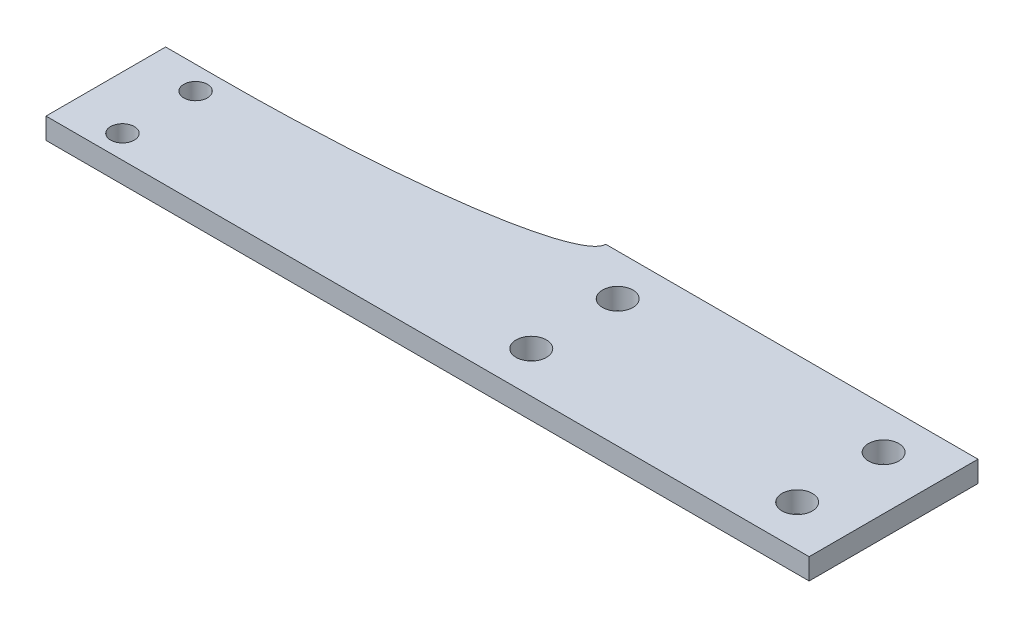
ISO-10303-21;
HEADER;
FILE_DESCRIPTION(('STEP AP214'),'2;1');
FILE_NAME('part.step','',(''),(''),'','','');
FILE_SCHEMA(('AUTOMOTIVE_DESIGN { 1 0 10303 214 1 1 1 1 }'));
ENDSEC;
DATA;
#1=APPLICATION_CONTEXT('core data for automotive mechanical design processes');
#2=APPLICATION_PROTOCOL_DEFINITION('international standard','automotive_design',2000,#1);
#3=PRODUCT_CONTEXT('',#1,'mechanical');
#4=PRODUCT('Part','Part','',(#3));
#5=PRODUCT_RELATED_PRODUCT_CATEGORY('part','',(#4));
#6=PRODUCT_DEFINITION_FORMATION('','',#4);
#7=PRODUCT_DEFINITION_CONTEXT('part definition',#1,'design');
#8=PRODUCT_DEFINITION('design','',#6,#7);
#9=PRODUCT_DEFINITION_SHAPE('','',#8);
#10=(LENGTH_UNIT() NAMED_UNIT(*) SI_UNIT(.MILLI.,.METRE.));
#11=(NAMED_UNIT(*) PLANE_ANGLE_UNIT() SI_UNIT($,.RADIAN.));
#12=(NAMED_UNIT(*) SI_UNIT($,.STERADIAN.) SOLID_ANGLE_UNIT());
#13=UNCERTAINTY_MEASURE_WITH_UNIT(LENGTH_MEASURE(1.E-05),#10,'distance_accuracy_value','');
#14=(GEOMETRIC_REPRESENTATION_CONTEXT(3) GLOBAL_UNCERTAINTY_ASSIGNED_CONTEXT((#13)) GLOBAL_UNIT_ASSIGNED_CONTEXT((#10,
#11,#12)) REPRESENTATION_CONTEXT('',''));
#15=CARTESIAN_POINT('',(0.,0.,0.));
#16=DIRECTION('',(0.,0.,1.));
#17=DIRECTION('',(1.,0.,0.));
#18=AXIS2_PLACEMENT_3D('',#15,#16,#17);
#19=CARTESIAN_POINT('',(-26.7,1.5875,-6.35));
#20=DIRECTION('',(0.,1.,0.));
#21=DIRECTION('',(0.,0.,1.));
#22=AXIS2_PLACEMENT_3D('',#19,#20,#21);
#23=PLANE('',#22);
#24=CARTESIAN_POINT('',(22.7,1.5875,-3.25));
#25=DIRECTION('',(0.,1.,0.));
#26=DIRECTION('',(0.,0.,1.));
#27=AXIS2_PLACEMENT_3D('',#24,#25,#26);
#28=CIRCLE('',#27,1.143);
#29=CARTESIAN_POINT('',(22.7,1.5875,-2.107));
#30=VERTEX_POINT('',#29);
#31=EDGE_CURVE('E196',#30,#30,#28,.T.);
#32=ORIENTED_EDGE('',*,*,#31,.F.);
#33=EDGE_LOOP('',(#32));
#34=FACE_BOUND('',#33,.T.);
#35=CARTESIAN_POINT('',(2.70000000000001,1.5875,-3.25));
#36=DIRECTION('',(0.,1.,0.));
#37=DIRECTION('',(0.,0.,1.));
#38=AXIS2_PLACEMENT_3D('',#35,#36,#37);
#39=CIRCLE('',#38,1.143);
#40=CARTESIAN_POINT('',(2.70000000000001,1.5875,-2.107));
#41=VERTEX_POINT('',#40);
#42=EDGE_CURVE('E208',#41,#41,#39,.T.);
#43=ORIENTED_EDGE('',*,*,#42,.F.);
#44=EDGE_LOOP('',(#43));
#45=FACE_BOUND('',#44,.T.);
#46=CARTESIAN_POINT('',(-26.7,1.5875,-0.899999999999998));
#47=DIRECTION('',(0.,1.,0.));
#48=DIRECTION('',(0.,0.,1.));
#49=AXIS2_PLACEMENT_3D('',#46,#47,#48);
#50=CIRCLE('',#49,0.89);
#51=CARTESIAN_POINT('',(-26.7,1.5875,-0.00999999999999829));
#52=VERTEX_POINT('',#51);
#53=EDGE_CURVE('E121',#52,#52,#50,.T.);
#54=ORIENTED_EDGE('',*,*,#53,.F.);
#55=EDGE_LOOP('',(#54));
#56=FACE_BOUND('',#55,.T.);
#57=DIRECTION('',(-1.,0.,0.));
#58=VECTOR('',#57,1.);
#59=CARTESIAN_POINT('',(26.7,1.5875,-6.35));
#60=LINE('',#59,#58);
#61=CARTESIAN_POINT('',(26.7,1.5875,-6.35));
#62=VERTEX_POINT('',#61);
#63=CARTESIAN_POINT('',(-1.3,1.5875,-6.35));
#64=VERTEX_POINT('',#63);
#65=EDGE_CURVE('E128',#62,#64,#60,.T.);
#66=ORIENTED_EDGE('',*,*,#65,.T.);
#67=CARTESIAN_POINT('',(-26.7,1.5875,-6.35));
#68=DIRECTION('',(0.,-1.,0.));
#69=DIRECTION('',(1.,0.,0.));
#70=AXIS2_PLACEMENT_3D('',#67,#68,#69);
#71=ELLIPSE('',#70,25.4,3.7);
#72=CARTESIAN_POINT('',(-26.7,1.5875,-2.65));
#73=VERTEX_POINT('',#72);
#74=EDGE_CURVE('E85',#64,#73,#71,.T.);
#75=ORIENTED_EDGE('',*,*,#74,.T.);
#76=DIRECTION('',(-1.,0.,0.));
#77=VECTOR('',#76,1.);
#78=CARTESIAN_POINT('',(-30.7,1.5875,-2.65));
#79=LINE('',#78,#77);
#80=CARTESIAN_POINT('',(-30.7,1.5875,-2.65));
#81=VERTEX_POINT('',#80);
#82=EDGE_CURVE('E98',#73,#81,#79,.T.);
#83=ORIENTED_EDGE('',*,*,#82,.T.);
#84=DIRECTION('',(0.,0.,1.));
#85=VECTOR('',#84,1.);
#86=CARTESIAN_POINT('',(-30.7,1.5875,6.35));
#87=LINE('',#86,#85);
#88=CARTESIAN_POINT('',(-30.7,1.5875,6.35));
#89=VERTEX_POINT('',#88);
#90=EDGE_CURVE('E92',#81,#89,#87,.T.);
#91=ORIENTED_EDGE('',*,*,#90,.T.);
#92=DIRECTION('',(1.,0.,0.));
#93=VECTOR('',#92,1.);
#94=CARTESIAN_POINT('',(-26.7,1.5875,6.35));
#95=LINE('',#94,#93);
#96=CARTESIAN_POINT('',(26.7,1.5875,6.35));
#97=VERTEX_POINT('',#96);
#98=EDGE_CURVE('E96',#89,#97,#95,.T.);
#99=ORIENTED_EDGE('',*,*,#98,.T.);
#100=DIRECTION('',(0.,0.,-1.));
#101=VECTOR('',#100,1.);
#102=CARTESIAN_POINT('',(26.7,1.5875,6.35));
#103=LINE('',#102,#101);
#104=EDGE_CURVE('E49',#97,#62,#103,.T.);
#105=ORIENTED_EDGE('',*,*,#104,.T.);
#106=EDGE_LOOP('',(#66,#75,#83,#91,#99,#105));
#107=FACE_BOUND('',#106,.T.);
#108=CARTESIAN_POINT('',(-26.7,1.5875,4.6));
#109=DIRECTION('',(0.,1.,0.));
#110=DIRECTION('',(0.,0.,1.));
#111=AXIS2_PLACEMENT_3D('',#108,#109,#110);
#112=CIRCLE('',#111,0.89);
#113=CARTESIAN_POINT('',(-26.7,1.5875,5.49));
#114=VERTEX_POINT('',#113);
#115=EDGE_CURVE('E214',#114,#114,#112,.T.);
#116=ORIENTED_EDGE('',*,*,#115,.F.);
#117=EDGE_LOOP('',(#116));
#118=FACE_BOUND('',#117,.T.);
#119=CARTESIAN_POINT('',(2.70000000000001,1.5875,3.25));
#120=DIRECTION('',(0.,1.,0.));
#121=DIRECTION('',(0.,0.,1.));
#122=AXIS2_PLACEMENT_3D('',#119,#120,#121);
#123=CIRCLE('',#122,1.143);
#124=CARTESIAN_POINT('',(2.70000000000001,1.5875,4.393));
#125=VERTEX_POINT('',#124);
#126=EDGE_CURVE('E202',#125,#125,#123,.T.);
#127=ORIENTED_EDGE('',*,*,#126,.F.);
#128=EDGE_LOOP('',(#127));
#129=FACE_BOUND('',#128,.T.);
#130=CARTESIAN_POINT('',(22.7,1.5875,3.25));
#131=DIRECTION('',(0.,1.,0.));
#132=DIRECTION('',(0.,0.,1.));
#133=AXIS2_PLACEMENT_3D('',#130,#131,#132);
#134=CIRCLE('',#133,1.143);
#135=CARTESIAN_POINT('',(22.7,1.5875,4.393));
#136=VERTEX_POINT('',#135);
#137=EDGE_CURVE('E187',#136,#136,#134,.T.);
#138=ORIENTED_EDGE('',*,*,#137,.F.);
#139=EDGE_LOOP('',(#138));
#140=FACE_BOUND('',#139,.T.);
#141=ADVANCED_FACE('F32',(#34,#45,#56,#107,#118,#129,#140),#23,.T.);
#142=CARTESIAN_POINT('',(-26.7,0.,-6.35));
#143=DIRECTION('',(0.,1.,0.));
#144=DIRECTION('',(0.,0.,1.));
#145=AXIS2_PLACEMENT_3D('',#142,#143,#144);
#146=PLANE('',#145);
#147=DIRECTION('',(-1.,0.,0.));
#148=VECTOR('',#147,1.);
#149=CARTESIAN_POINT('',(26.7,0.,-6.35));
#150=LINE('',#149,#148);
#151=CARTESIAN_POINT('',(26.7,0.,-6.35));
#152=VERTEX_POINT('',#151);
#153=CARTESIAN_POINT('',(-1.3,0.,-6.35));
#154=VERTEX_POINT('',#153);
#155=EDGE_CURVE('E117',#152,#154,#150,.T.);
#156=ORIENTED_EDGE('',*,*,#155,.F.);
#157=DIRECTION('',(0.,0.,-1.));
#158=VECTOR('',#157,1.);
#159=CARTESIAN_POINT('',(26.7,0.,6.35));
#160=LINE('',#159,#158);
#161=CARTESIAN_POINT('',(26.7,0.,6.35));
#162=VERTEX_POINT('',#161);
#163=EDGE_CURVE('E77',#162,#152,#160,.T.);
#164=ORIENTED_EDGE('',*,*,#163,.F.);
#165=DIRECTION('',(1.,0.,0.));
#166=VECTOR('',#165,1.);
#167=CARTESIAN_POINT('',(-26.7,0.,6.35));
#168=LINE('',#167,#166);
#169=CARTESIAN_POINT('',(-30.7,0.,6.35));
#170=VERTEX_POINT('',#169);
#171=EDGE_CURVE('E71',#170,#162,#168,.T.);
#172=ORIENTED_EDGE('',*,*,#171,.F.);
#173=DIRECTION('',(0.,0.,1.));
#174=VECTOR('',#173,1.);
#175=CARTESIAN_POINT('',(-30.7,0.,6.35));
#176=LINE('',#175,#174);
#177=CARTESIAN_POINT('',(-30.7,0.,-2.65));
#178=VERTEX_POINT('',#177);
#179=EDGE_CURVE('E107',#178,#170,#176,.T.);
#180=ORIENTED_EDGE('',*,*,#179,.F.);
#181=DIRECTION('',(-1.,0.,0.));
#182=VECTOR('',#181,1.);
#183=CARTESIAN_POINT('',(-30.7,0.,-2.65));
#184=LINE('',#183,#182);
#185=CARTESIAN_POINT('',(-26.7,0.,-2.65));
#186=VERTEX_POINT('',#185);
#187=EDGE_CURVE('E123',#186,#178,#184,.T.);
#188=ORIENTED_EDGE('',*,*,#187,.F.);
#189=CARTESIAN_POINT('',(-26.7,0.,-6.35));
#190=DIRECTION('',(0.,-1.,0.));
#191=DIRECTION('',(1.,0.,0.));
#192=AXIS2_PLACEMENT_3D('',#189,#190,#191);
#193=ELLIPSE('',#192,25.4,3.7);
#194=EDGE_CURVE('E120',#154,#186,#193,.T.);
#195=ORIENTED_EDGE('',*,*,#194,.F.);
#196=EDGE_LOOP('',(#156,#164,#172,#180,#188,#195));
#197=FACE_BOUND('',#196,.T.);
#198=CARTESIAN_POINT('',(-26.7,0.,-0.899999999999998));
#199=DIRECTION('',(0.,1.,0.));
#200=DIRECTION('',(0.,0.,1.));
#201=AXIS2_PLACEMENT_3D('',#198,#199,#200);
#202=CIRCLE('',#201,0.89);
#203=CARTESIAN_POINT('',(-26.7,0.,-0.00999999999999829));
#204=VERTEX_POINT('',#203);
#205=EDGE_CURVE('E217',#204,#204,#202,.T.);
#206=ORIENTED_EDGE('',*,*,#205,.T.);
#207=EDGE_LOOP('',(#206));
#208=FACE_BOUND('',#207,.T.);
#209=CARTESIAN_POINT('',(-26.7,0.,4.6));
#210=DIRECTION('',(0.,1.,0.));
#211=DIRECTION('',(0.,0.,1.));
#212=AXIS2_PLACEMENT_3D('',#209,#210,#211);
#213=CIRCLE('',#212,0.89);
#214=CARTESIAN_POINT('',(-26.7,0.,5.49));
#215=VERTEX_POINT('',#214);
#216=EDGE_CURVE('E211',#215,#215,#213,.T.);
#217=ORIENTED_EDGE('',*,*,#216,.T.);
#218=EDGE_LOOP('',(#217));
#219=FACE_BOUND('',#218,.T.);
#220=CARTESIAN_POINT('',(2.70000000000001,0.,-3.25));
#221=DIRECTION('',(0.,1.,0.));
#222=DIRECTION('',(0.,0.,1.));
#223=AXIS2_PLACEMENT_3D('',#220,#221,#222);
#224=CIRCLE('',#223,1.143);
#225=CARTESIAN_POINT('',(2.70000000000001,0.,-2.107));
#226=VERTEX_POINT('',#225);
#227=EDGE_CURVE('E205',#226,#226,#224,.T.);
#228=ORIENTED_EDGE('',*,*,#227,.T.);
#229=EDGE_LOOP('',(#228));
#230=FACE_BOUND('',#229,.T.);
#231=CARTESIAN_POINT('',(2.70000000000001,0.,3.25));
#232=DIRECTION('',(0.,1.,0.));
#233=DIRECTION('',(0.,0.,1.));
#234=AXIS2_PLACEMENT_3D('',#231,#232,#233);
#235=CIRCLE('',#234,1.143);
#236=CARTESIAN_POINT('',(2.70000000000001,0.,4.393));
#237=VERTEX_POINT('',#236);
#238=EDGE_CURVE('E199',#237,#237,#235,.T.);
#239=ORIENTED_EDGE('',*,*,#238,.T.);
#240=EDGE_LOOP('',(#239));
#241=FACE_BOUND('',#240,.T.);
#242=CARTESIAN_POINT('',(22.7,0.,-3.25));
#243=DIRECTION('',(0.,1.,0.));
#244=DIRECTION('',(0.,0.,1.));
#245=AXIS2_PLACEMENT_3D('',#242,#243,#244);
#246=CIRCLE('',#245,1.143);
#247=CARTESIAN_POINT('',(22.7,0.,-2.107));
#248=VERTEX_POINT('',#247);
#249=EDGE_CURVE('E193',#248,#248,#246,.T.);
#250=ORIENTED_EDGE('',*,*,#249,.T.);
#251=EDGE_LOOP('',(#250));
#252=FACE_BOUND('',#251,.T.);
#253=CARTESIAN_POINT('',(22.7,0.,3.25));
#254=DIRECTION('',(0.,1.,0.));
#255=DIRECTION('',(0.,0.,1.));
#256=AXIS2_PLACEMENT_3D('',#253,#254,#255);
#257=CIRCLE('',#256,1.143);
#258=CARTESIAN_POINT('',(22.7,0.,4.393));
#259=VERTEX_POINT('',#258);
#260=EDGE_CURVE('E190',#259,#259,#257,.T.);
#261=ORIENTED_EDGE('',*,*,#260,.T.);
#262=EDGE_LOOP('',(#261));
#263=FACE_BOUND('',#262,.T.);
#264=ADVANCED_FACE('F137',(#197,#208,#219,#230,#241,#252,#263),#146,.F.);
#265=CARTESIAN_POINT('',(26.7,1.5875,-6.35));
#266=DIRECTION('',(0.,0.,1.));
#267=DIRECTION('',(1.,0.,0.));
#268=AXIS2_PLACEMENT_3D('',#265,#266,#267);
#269=PLANE('',#268);
#270=ORIENTED_EDGE('',*,*,#155,.T.);
#271=DIRECTION('',(0.,-1.,0.));
#272=VECTOR('',#271,1.);
#273=CARTESIAN_POINT('',(-1.3,1.5875,-6.35));
#274=LINE('',#273,#272);
#275=EDGE_CURVE('E11',#64,#154,#274,.T.);
#276=ORIENTED_EDGE('',*,*,#275,.F.);
#277=ORIENTED_EDGE('',*,*,#65,.F.);
#278=DIRECTION('',(0.,-1.,0.));
#279=VECTOR('',#278,1.);
#280=CARTESIAN_POINT('',(26.7,1.5875,-6.35));
#281=LINE('',#280,#279);
#282=EDGE_CURVE('E113',#62,#152,#281,.T.);
#283=ORIENTED_EDGE('',*,*,#282,.T.);
#284=EDGE_LOOP('',(#270,#276,#277,#283));
#285=FACE_BOUND('',#284,.T.);
#286=ADVANCED_FACE('F34',(#285),#269,.F.);
#287=DIRECTION('',(0.,-1.,0.));
#288=VECTOR('',#287,1.);
#289=SURFACE_OF_LINEAR_EXTRUSION('',#71,#288);
#290=ORIENTED_EDGE('',*,*,#194,.T.);
#291=DIRECTION('',(0.,-1.,0.));
#292=VECTOR('',#291,1.);
#293=CARTESIAN_POINT('',(-26.7,1.5875,-2.65));
#294=LINE('',#293,#292);
#295=EDGE_CURVE('E41',#73,#186,#294,.T.);
#296=ORIENTED_EDGE('',*,*,#295,.F.);
#297=ORIENTED_EDGE('',*,*,#74,.F.);
#298=ORIENTED_EDGE('',*,*,#275,.T.);
#299=EDGE_LOOP('',(#290,#296,#297,#298));
#300=FACE_BOUND('',#299,.T.);
#301=ADVANCED_FACE('F226',(#300),#289,.F.);
#302=CARTESIAN_POINT('',(-30.7,1.5875,-2.65));
#303=DIRECTION('',(0.,0.,1.));
#304=DIRECTION('',(1.,0.,0.));
#305=AXIS2_PLACEMENT_3D('',#302,#303,#304);
#306=PLANE('',#305);
#307=ORIENTED_EDGE('',*,*,#187,.T.);
#308=DIRECTION('',(0.,-1.,0.));
#309=VECTOR('',#308,1.);
#310=CARTESIAN_POINT('',(-30.7,1.5875,-2.65));
#311=LINE('',#310,#309);
#312=EDGE_CURVE('E108',#81,#178,#311,.T.);
#313=ORIENTED_EDGE('',*,*,#312,.F.);
#314=ORIENTED_EDGE('',*,*,#82,.F.);
#315=ORIENTED_EDGE('',*,*,#295,.T.);
#316=EDGE_LOOP('',(#307,#313,#314,#315));
#317=FACE_BOUND('',#316,.T.);
#318=ADVANCED_FACE('F134',(#317),#306,.F.);
#319=CARTESIAN_POINT('',(-30.7,1.5875,6.35));
#320=DIRECTION('',(1.,0.,0.));
#321=DIRECTION('',(0.,0.,-1.));
#322=AXIS2_PLACEMENT_3D('',#319,#320,#321);
#323=PLANE('',#322);
#324=ORIENTED_EDGE('',*,*,#179,.T.);
#325=DIRECTION('',(0.,-1.,0.));
#326=VECTOR('',#325,1.);
#327=CARTESIAN_POINT('',(-30.7,1.5875,6.35));
#328=LINE('',#327,#326);
#329=EDGE_CURVE('E104',#89,#170,#328,.T.);
#330=ORIENTED_EDGE('',*,*,#329,.F.);
#331=ORIENTED_EDGE('',*,*,#90,.F.);
#332=ORIENTED_EDGE('',*,*,#312,.T.);
#333=EDGE_LOOP('',(#324,#330,#331,#332));
#334=FACE_BOUND('',#333,.T.);
#335=ADVANCED_FACE('F105',(#334),#323,.F.);
#336=CARTESIAN_POINT('',(-26.7,1.5875,6.35));
#337=DIRECTION('',(0.,0.,-1.));
#338=DIRECTION('',(-1.,0.,0.));
#339=AXIS2_PLACEMENT_3D('',#336,#337,#338);
#340=PLANE('',#339);
#341=ORIENTED_EDGE('',*,*,#171,.T.);
#342=DIRECTION('',(0.,-1.,0.));
#343=VECTOR('',#342,1.);
#344=CARTESIAN_POINT('',(26.7,1.5875,6.35));
#345=LINE('',#344,#343);
#346=EDGE_CURVE('E109',#97,#162,#345,.T.);
#347=ORIENTED_EDGE('',*,*,#346,.F.);
#348=ORIENTED_EDGE('',*,*,#98,.F.);
#349=ORIENTED_EDGE('',*,*,#329,.T.);
#350=EDGE_LOOP('',(#341,#347,#348,#349));
#351=FACE_BOUND('',#350,.T.);
#352=ADVANCED_FACE('F111',(#351),#340,.F.);
#353=CARTESIAN_POINT('',(26.7,1.5875,6.35));
#354=DIRECTION('',(-1.,0.,0.));
#355=DIRECTION('',(0.,0.,1.));
#356=AXIS2_PLACEMENT_3D('',#353,#354,#355);
#357=PLANE('',#356);
#358=ORIENTED_EDGE('',*,*,#163,.T.);
#359=ORIENTED_EDGE('',*,*,#282,.F.);
#360=ORIENTED_EDGE('',*,*,#104,.F.);
#361=ORIENTED_EDGE('',*,*,#346,.T.);
#362=EDGE_LOOP('',(#358,#359,#360,#361));
#363=FACE_BOUND('',#362,.T.);
#364=ADVANCED_FACE('F142',(#363),#357,.F.);
#365=CARTESIAN_POINT('',(-26.7,1.5875,-0.899999999999998));
#366=DIRECTION('',(0.,-1.,0.));
#367=DIRECTION('',(0.,0.,-1.));
#368=AXIS2_PLACEMENT_3D('',#365,#366,#367);
#369=CYLINDRICAL_SURFACE('',#368,0.89);
#370=ORIENTED_EDGE('',*,*,#53,.T.);
#371=EDGE_LOOP('',(#370));
#372=FACE_BOUND('',#371,.T.);
#373=ORIENTED_EDGE('',*,*,#205,.F.);
#374=EDGE_LOOP('',(#373));
#375=FACE_BOUND('',#374,.T.);
#376=ADVANCED_FACE('F144',(#372,#375),#369,.F.);
#377=CARTESIAN_POINT('',(-26.7,1.5875,4.6));
#378=DIRECTION('',(0.,-1.,0.));
#379=DIRECTION('',(0.,0.,-1.));
#380=AXIS2_PLACEMENT_3D('',#377,#378,#379);
#381=CYLINDRICAL_SURFACE('',#380,0.89);
#382=ORIENTED_EDGE('',*,*,#115,.T.);
#383=EDGE_LOOP('',(#382));
#384=FACE_BOUND('',#383,.T.);
#385=ORIENTED_EDGE('',*,*,#216,.F.);
#386=EDGE_LOOP('',(#385));
#387=FACE_BOUND('',#386,.T.);
#388=ADVANCED_FACE('F150',(#384,#387),#381,.F.);
#389=CARTESIAN_POINT('',(2.70000000000001,1.5875,-3.25));
#390=DIRECTION('',(0.,-1.,0.));
#391=DIRECTION('',(0.,0.,-1.));
#392=AXIS2_PLACEMENT_3D('',#389,#390,#391);
#393=CYLINDRICAL_SURFACE('',#392,1.143);
#394=ORIENTED_EDGE('',*,*,#42,.T.);
#395=EDGE_LOOP('',(#394));
#396=FACE_BOUND('',#395,.T.);
#397=ORIENTED_EDGE('',*,*,#227,.F.);
#398=EDGE_LOOP('',(#397));
#399=FACE_BOUND('',#398,.T.);
#400=ADVANCED_FACE('F166',(#396,#399),#393,.F.);
#401=CARTESIAN_POINT('',(2.70000000000001,1.5875,3.25));
#402=DIRECTION('',(0.,-1.,0.));
#403=DIRECTION('',(0.,0.,-1.));
#404=AXIS2_PLACEMENT_3D('',#401,#402,#403);
#405=CYLINDRICAL_SURFACE('',#404,1.143);
#406=ORIENTED_EDGE('',*,*,#126,.T.);
#407=EDGE_LOOP('',(#406));
#408=FACE_BOUND('',#407,.T.);
#409=ORIENTED_EDGE('',*,*,#238,.F.);
#410=EDGE_LOOP('',(#409));
#411=FACE_BOUND('',#410,.T.);
#412=ADVANCED_FACE('F170',(#408,#411),#405,.F.);
#413=CARTESIAN_POINT('',(22.7,1.5875,-3.25));
#414=DIRECTION('',(0.,-1.,0.));
#415=DIRECTION('',(0.,0.,-1.));
#416=AXIS2_PLACEMENT_3D('',#413,#414,#415);
#417=CYLINDRICAL_SURFACE('',#416,1.143);
#418=ORIENTED_EDGE('',*,*,#31,.T.);
#419=EDGE_LOOP('',(#418));
#420=FACE_BOUND('',#419,.T.);
#421=ORIENTED_EDGE('',*,*,#249,.F.);
#422=EDGE_LOOP('',(#421));
#423=FACE_BOUND('',#422,.T.);
#424=ADVANCED_FACE('F174',(#420,#423),#417,.F.);
#425=CARTESIAN_POINT('',(22.7,1.5875,3.25));
#426=DIRECTION('',(0.,-1.,0.));
#427=DIRECTION('',(0.,0.,-1.));
#428=AXIS2_PLACEMENT_3D('',#425,#426,#427);
#429=CYLINDRICAL_SURFACE('',#428,1.143);
#430=ORIENTED_EDGE('',*,*,#137,.T.);
#431=EDGE_LOOP('',(#430));
#432=FACE_BOUND('',#431,.T.);
#433=ORIENTED_EDGE('',*,*,#260,.F.);
#434=EDGE_LOOP('',(#433));
#435=FACE_BOUND('',#434,.T.);
#436=ADVANCED_FACE('F178',(#432,#435),#429,.F.);
#437=CLOSED_SHELL('',(#141,#264,#286,#301,#318,#335,#352,#364,#376,#388,#400,#412,#424,#436));
#438=MANIFOLD_SOLID_BREP('B2',#437);
#439=ADVANCED_BREP_SHAPE_REPRESENTATION('',(#18,#438),#14);
#440=SHAPE_DEFINITION_REPRESENTATION(#9,#439);
ENDSEC;
END-ISO-10303-21;
